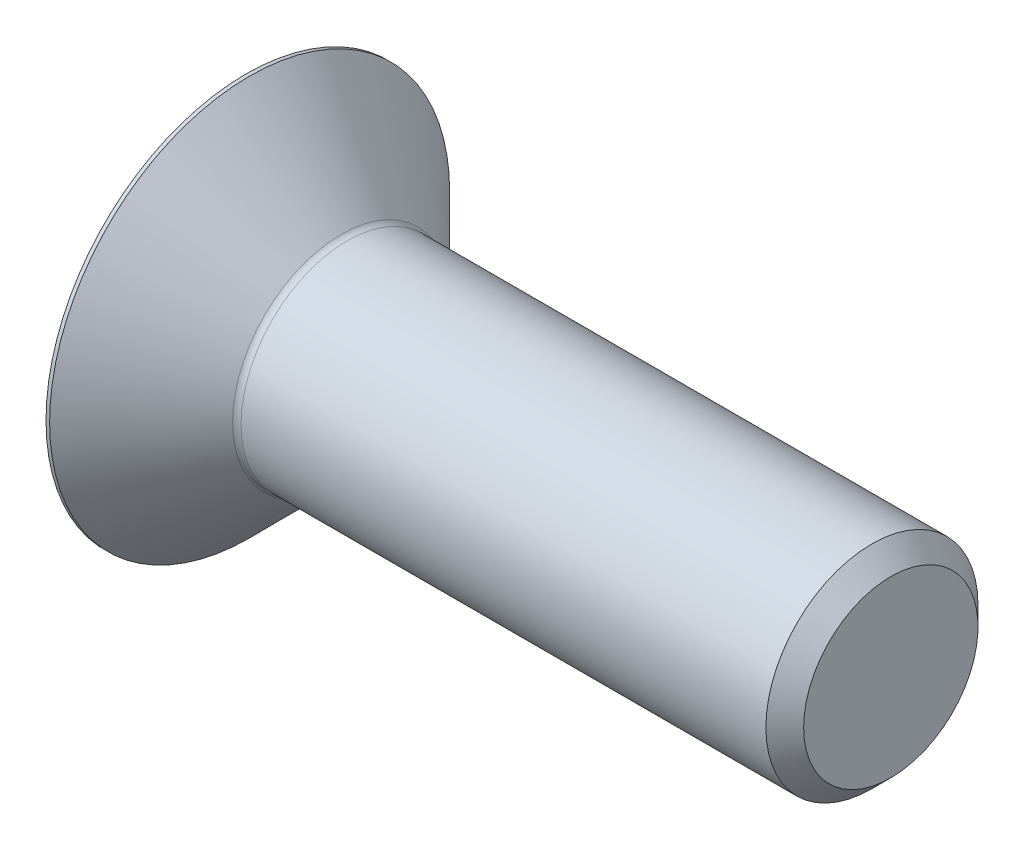
ISO-10303-21;
HEADER;
FILE_DESCRIPTION(('STEP AP214'),'2;1');
FILE_NAME('part.step','',(''),(''),'','','');
FILE_SCHEMA(('AUTOMOTIVE_DESIGN { 1 0 10303 214 1 1 1 1 }'));
ENDSEC;
DATA;
#1=APPLICATION_CONTEXT('core data for automotive mechanical design processes');
#2=APPLICATION_PROTOCOL_DEFINITION('international standard','automotive_design',2000,#1);
#3=PRODUCT_CONTEXT('',#1,'mechanical');
#4=PRODUCT('Part','Part','',(#3));
#5=PRODUCT_RELATED_PRODUCT_CATEGORY('part','',(#4));
#6=PRODUCT_DEFINITION_FORMATION('','',#4);
#7=PRODUCT_DEFINITION_CONTEXT('part definition',#1,'design');
#8=PRODUCT_DEFINITION('design','',#6,#7);
#9=PRODUCT_DEFINITION_SHAPE('','',#8);
#10=(LENGTH_UNIT() NAMED_UNIT(*) SI_UNIT(.MILLI.,.METRE.));
#11=(NAMED_UNIT(*) PLANE_ANGLE_UNIT() SI_UNIT($,.RADIAN.));
#12=(NAMED_UNIT(*) SI_UNIT($,.STERADIAN.) SOLID_ANGLE_UNIT());
#13=UNCERTAINTY_MEASURE_WITH_UNIT(LENGTH_MEASURE(1.E-05),#10,'distance_accuracy_value','');
#14=(GEOMETRIC_REPRESENTATION_CONTEXT(3) GLOBAL_UNCERTAINTY_ASSIGNED_CONTEXT((#13)) GLOBAL_UNIT_ASSIGNED_CONTEXT((#10,
#11,#12)) REPRESENTATION_CONTEXT('',''));
#15=CARTESIAN_POINT('',(0.,0.,0.));
#16=DIRECTION('',(0.,0.,1.));
#17=DIRECTION('',(1.,0.,0.));
#18=AXIS2_PLACEMENT_3D('',#15,#16,#17);
#19=CARTESIAN_POINT('',(0.,0.,0.));
#20=DIRECTION('',(-1.,0.,0.));
#21=DIRECTION('',(0.,0.,1.));
#22=AXIS2_PLACEMENT_3D('',#19,#20,#21);
#23=CYLINDRICAL_SURFACE('',#22,4.715);
#24=CARTESIAN_POINT('',(0.885000000000011,0.,0.));
#25=DIRECTION('',(-1.,0.,0.));
#26=DIRECTION('',(0.,0.,1.));
#27=AXIS2_PLACEMENT_3D('',#24,#25,#26);
#28=CIRCLE('',#27,4.715);
#29=CARTESIAN_POINT('',(0.885000000000011,0.,4.715));
#30=VERTEX_POINT('',#29);
#31=EDGE_CURVE('E155',#30,#30,#28,.T.);
#32=ORIENTED_EDGE('',*,*,#31,.T.);
#33=EDGE_LOOP('',(#32));
#34=FACE_BOUND('',#33,.T.);
#35=CARTESIAN_POINT('',(0.8,0.,0.));
#36=DIRECTION('',(-1.,0.,0.));
#37=DIRECTION('',(0.,0.,1.));
#38=AXIS2_PLACEMENT_3D('',#35,#36,#37);
#39=CIRCLE('',#38,4.715);
#40=CARTESIAN_POINT('',(0.8,0.,4.715));
#41=VERTEX_POINT('',#40);
#42=EDGE_CURVE('E181',#41,#41,#39,.T.);
#43=ORIENTED_EDGE('',*,*,#42,.F.);
#44=EDGE_LOOP('',(#43));
#45=FACE_BOUND('',#44,.T.);
#46=ADVANCED_FACE('F32',(#34,#45),#23,.T.);
#47=CARTESIAN_POINT('',(0.885000000000011,0.,0.));
#48=DIRECTION('',(-1.,0.,0.));
#49=DIRECTION('',(0.,0.,1.));
#50=AXIS2_PLACEMENT_3D('',#47,#48,#49);
#51=CONICAL_SURFACE('',#50,4.715,0.785398163397451);
#52=CARTESIAN_POINT('',(3.04142135623731,0.,0.));
#53=DIRECTION('',(-1.,0.,0.));
#54=DIRECTION('',(0.,0.,1.));
#55=AXIS2_PLACEMENT_3D('',#52,#53,#54);
#56=CIRCLE('',#55,2.55857864376269);
#57=CARTESIAN_POINT('',(3.04142135623731,0.,2.55857864376269));
#58=VERTEX_POINT('',#57);
#59=EDGE_CURVE('E158',#58,#58,#56,.T.);
#60=ORIENTED_EDGE('',*,*,#59,.T.);
#61=EDGE_LOOP('',(#60));
#62=FACE_BOUND('',#61,.T.);
#63=ORIENTED_EDGE('',*,*,#31,.F.);
#64=EDGE_LOOP('',(#63));
#65=FACE_BOUND('',#64,.T.);
#66=ADVANCED_FACE('F171',(#62,#65),#51,.T.);
#67=CARTESIAN_POINT('',(0.,0.,0.));
#68=DIRECTION('',(-1.,0.,0.));
#69=DIRECTION('',(0.,0.,1.));
#70=AXIS2_PLACEMENT_3D('',#67,#68,#69);
#71=CYLINDRICAL_SURFACE('',#70,2.5);
#72=CARTESIAN_POINT('',(3.18284271247462,0.,0.));
#73=DIRECTION('',(-1.,0.,0.));
#74=DIRECTION('',(0.,0.,1.));
#75=AXIS2_PLACEMENT_3D('',#72,#73,#74);
#76=CIRCLE('',#75,2.5);
#77=CARTESIAN_POINT('',(3.18284271247462,0.,2.5));
#78=VERTEX_POINT('',#77);
#79=EDGE_CURVE('E40',#78,#78,#76,.F.);
#80=ORIENTED_EDGE('',*,*,#79,.T.);
#81=EDGE_LOOP('',(#80));
#82=FACE_BOUND('',#81,.T.);
#83=CARTESIAN_POINT('',(15.555,0.,0.));
#84=DIRECTION('',(-1.,0.,0.));
#85=DIRECTION('',(0.,0.,1.));
#86=AXIS2_PLACEMENT_3D('',#83,#84,#85);
#87=CIRCLE('',#86,2.5);
#88=CARTESIAN_POINT('',(15.555,0.,2.5));
#89=VERTEX_POINT('',#88);
#90=EDGE_CURVE('E152',#89,#89,#87,.T.);
#91=ORIENTED_EDGE('',*,*,#90,.T.);
#92=EDGE_LOOP('',(#91));
#93=FACE_BOUND('',#92,.T.);
#94=ADVANCED_FACE('F163',(#82,#93),#71,.T.);
#95=CARTESIAN_POINT('',(16.,0.,0.));
#96=DIRECTION('',(-1.,0.,0.));
#97=DIRECTION('',(0.,0.,1.));
#98=AXIS2_PLACEMENT_3D('',#95,#96,#97);
#99=CONICAL_SURFACE('',#98,2.055,0.785398163397446);
#100=ORIENTED_EDGE('',*,*,#90,.F.);
#101=EDGE_LOOP('',(#100));
#102=FACE_BOUND('',#101,.T.);
#103=CARTESIAN_POINT('',(16.,0.,0.));
#104=DIRECTION('',(-1.,0.,0.));
#105=DIRECTION('',(0.,0.,1.));
#106=AXIS2_PLACEMENT_3D('',#103,#104,#105);
#107=CIRCLE('',#106,2.055);
#108=CARTESIAN_POINT('',(16.,0.,2.055));
#109=VERTEX_POINT('',#108);
#110=EDGE_CURVE('E148',#109,#109,#107,.T.);
#111=ORIENTED_EDGE('',*,*,#110,.T.);
#112=EDGE_LOOP('',(#111));
#113=FACE_BOUND('',#112,.T.);
#114=ADVANCED_FACE('F262',(#102,#113),#99,.T.);
#115=CARTESIAN_POINT('',(16.,2.055,0.));
#116=DIRECTION('',(1.,0.,0.));
#117=DIRECTION('',(0.,0.,-1.));
#118=AXIS2_PLACEMENT_3D('',#115,#116,#117);
#119=PLANE('',#118);
#120=ORIENTED_EDGE('',*,*,#110,.F.);
#121=EDGE_LOOP('',(#120));
#122=FACE_BOUND('',#121,.T.);
#123=ADVANCED_FACE('F168',(#122),#119,.T.);
#124=CARTESIAN_POINT('',(3.18284271247462,0.,0.));
#125=DIRECTION('',(-1.,0.,0.));
#126=DIRECTION('',(0.,0.,1.));
#127=AXIS2_PLACEMENT_3D('',#124,#125,#126);
#128=TOROIDAL_SURFACE('',#127,2.7,0.2);
#129=ORIENTED_EDGE('',*,*,#79,.F.);
#130=EDGE_LOOP('',(#129));
#131=FACE_BOUND('',#130,.T.);
#132=ORIENTED_EDGE('',*,*,#59,.F.);
#133=EDGE_LOOP('',(#132));
#134=FACE_BOUND('',#133,.T.);
#135=ADVANCED_FACE('F34',(#131,#134),#128,.F.);
#136=CARTESIAN_POINT('',(0.8,0.,0.));
#137=DIRECTION('',(-1.,0.,0.));
#138=DIRECTION('',(0.,0.,1.));
#139=AXIS2_PLACEMENT_3D('',#136,#137,#138);
#140=PLANE('',#139);
#141=DIRECTION('',(0.,-1.,0.));
#142=VECTOR('',#141,1.);
#143=CARTESIAN_POINT('',(0.8,-0.866025403784438,-1.5));
#144=LINE('',#143,#142);
#145=CARTESIAN_POINT('',(0.8,0.866025403784438,-1.5));
#146=VERTEX_POINT('',#145);
#147=CARTESIAN_POINT('',(0.8,-0.866025403784438,-1.5));
#148=VERTEX_POINT('',#147);
#149=EDGE_CURVE('E121',#146,#148,#144,.T.);
#150=ORIENTED_EDGE('',*,*,#149,.F.);
#151=DIRECTION('',(0.,-0.500000000000001,-0.866025403784438));
#152=VECTOR('',#151,1.);
#153=CARTESIAN_POINT('',(0.8,0.866025403784438,-1.5));
#154=LINE('',#153,#152);
#155=CARTESIAN_POINT('',(0.8,1.73205080756888,0.));
#156=VERTEX_POINT('',#155);
#157=EDGE_CURVE('E188',#156,#146,#154,.T.);
#158=ORIENTED_EDGE('',*,*,#157,.F.);
#159=DIRECTION('',(0.,0.5,-0.866025403784439));
#160=VECTOR('',#159,1.);
#161=CARTESIAN_POINT('',(0.8,1.73205080756888,0.));
#162=LINE('',#161,#160);
#163=CARTESIAN_POINT('',(0.8,0.866025403784438,1.5));
#164=VERTEX_POINT('',#163);
#165=EDGE_CURVE('E183',#164,#156,#162,.T.);
#166=ORIENTED_EDGE('',*,*,#165,.F.);
#167=DIRECTION('',(0.,1.,0.));
#168=VECTOR('',#167,1.);
#169=CARTESIAN_POINT('',(0.8,0.866025403784438,1.5));
#170=LINE('',#169,#168);
#171=CARTESIAN_POINT('',(0.800000000000001,-0.866025403784438,1.5));
#172=VERTEX_POINT('',#171);
#173=EDGE_CURVE('E47',#172,#164,#170,.T.);
#174=ORIENTED_EDGE('',*,*,#173,.F.);
#175=DIRECTION('',(0.,0.499999999999999,0.866025403784439));
#176=VECTOR('',#175,1.);
#177=CARTESIAN_POINT('',(0.8,-0.866025403784438,1.5));
#178=LINE('',#177,#176);
#179=CARTESIAN_POINT('',(0.8,-1.73205080756887,0.));
#180=VERTEX_POINT('',#179);
#181=EDGE_CURVE('E11',#180,#172,#178,.T.);
#182=ORIENTED_EDGE('',*,*,#181,.F.);
#183=DIRECTION('',(0.,-0.499999999999999,0.866025403784439));
#184=VECTOR('',#183,1.);
#185=CARTESIAN_POINT('',(0.8,-1.73205080756887,0.));
#186=LINE('',#185,#184);
#187=EDGE_CURVE('E106',#148,#180,#186,.T.);
#188=ORIENTED_EDGE('',*,*,#187,.F.);
#189=EDGE_LOOP('',(#150,#158,#166,#174,#182,#188));
#190=FACE_BOUND('',#189,.T.);
#191=ORIENTED_EDGE('',*,*,#42,.T.);
#192=EDGE_LOOP('',(#191));
#193=FACE_BOUND('',#192,.T.);
#194=ADVANCED_FACE('F104',(#190,#193),#140,.T.);
#195=CARTESIAN_POINT('',(1.9,0.,0.));
#196=DIRECTION('',(-1.,0.,0.));
#197=DIRECTION('',(0.,0.,1.));
#198=AXIS2_PLACEMENT_3D('',#195,#196,#197);
#199=CONICAL_SURFACE('',#198,1.5,1.04719755119659);
#200=CARTESIAN_POINT('',(2.76602540378445,0.,0.));
#201=VERTEX_POINT('',#200);
#202=VERTEX_LOOP('',#201);
#203=FACE_BOUND('',#202,.T.);
#204=CARTESIAN_POINT('',(1.9,0.,0.));
#205=DIRECTION('',(-1.,0.,0.));
#206=DIRECTION('',(0.,0.,1.));
#207=AXIS2_PLACEMENT_3D('',#204,#205,#206);
#208=CIRCLE('',#207,1.5);
#209=CARTESIAN_POINT('',(1.9,0.,1.5));
#210=VERTEX_POINT('',#209);
#211=CARTESIAN_POINT('',(1.9,1.29903810567666,0.750000000000001));
#212=VERTEX_POINT('',#211);
#213=EDGE_CURVE('E145',#210,#212,#208,.T.);
#214=ORIENTED_EDGE('',*,*,#213,.T.);
#215=CARTESIAN_POINT('',(1.9,1.29903810567666,-0.750000000000003));
#216=VERTEX_POINT('',#215);
#217=EDGE_CURVE('E149',#212,#216,#208,.T.);
#218=ORIENTED_EDGE('',*,*,#217,.T.);
#219=CARTESIAN_POINT('',(1.9,0.,-1.5));
#220=VERTEX_POINT('',#219);
#221=EDGE_CURVE('E227',#216,#220,#208,.T.);
#222=ORIENTED_EDGE('',*,*,#221,.T.);
#223=CARTESIAN_POINT('',(1.9,-1.29903810567666,-0.749999999999998));
#224=VERTEX_POINT('',#223);
#225=EDGE_CURVE('E224',#220,#224,#208,.T.);
#226=ORIENTED_EDGE('',*,*,#225,.T.);
#227=CARTESIAN_POINT('',(1.9,-1.29903810567666,0.749999999999997));
#228=VERTEX_POINT('',#227);
#229=EDGE_CURVE('E217',#224,#228,#208,.T.);
#230=ORIENTED_EDGE('',*,*,#229,.T.);
#231=EDGE_CURVE('E144',#228,#210,#208,.T.);
#232=ORIENTED_EDGE('',*,*,#231,.T.);
#233=EDGE_LOOP('',(#214,#218,#222,#226,#230,#232));
#234=FACE_BOUND('',#233,.T.);
#235=ADVANCED_FACE('F225',(#203,#234),#199,.F.);
#236=CARTESIAN_POINT('',(1.9,-0.866025403784437,-1.5));
#237=DIRECTION('',(1.,0.,0.));
#238=DIRECTION('',(0.,0.,-1.));
#239=AXIS2_PLACEMENT_3D('',#236,#237,#238);
#240=PLANE('',#239);
#241=DIRECTION('',(0.,1.,0.));
#242=VECTOR('',#241,1.);
#243=CARTESIAN_POINT('',(1.9,-0.866025403784438,-1.5));
#244=LINE('',#243,#242);
#245=CARTESIAN_POINT('',(1.9,-0.866025403784438,-1.5));
#246=VERTEX_POINT('',#245);
#247=EDGE_CURVE('E54',#246,#220,#244,.T.);
#248=ORIENTED_EDGE('',*,*,#247,.F.);
#249=DIRECTION('',(0.,0.499999999999999,-0.866025403784439));
#250=VECTOR('',#249,1.);
#251=CARTESIAN_POINT('',(1.9,-1.73205080756887,0.));
#252=LINE('',#251,#250);
#253=EDGE_CURVE('E120',#224,#246,#252,.T.);
#254=ORIENTED_EDGE('',*,*,#253,.F.);
#255=ORIENTED_EDGE('',*,*,#225,.F.);
#256=EDGE_LOOP('',(#248,#254,#255));
#257=FACE_BOUND('',#256,.T.);
#258=ADVANCED_FACE('F258',(#257),#240,.F.);
#259=DIRECTION('',(0.,0.500000000000001,0.866025403784438));
#260=VECTOR('',#259,1.);
#261=CARTESIAN_POINT('',(1.9,0.866025403784438,-1.5));
#262=LINE('',#261,#260);
#263=CARTESIAN_POINT('',(1.9,0.866025403784438,-1.5));
#264=VERTEX_POINT('',#263);
#265=EDGE_CURVE('E197',#264,#216,#262,.T.);
#266=ORIENTED_EDGE('',*,*,#265,.F.);
#267=EDGE_CURVE('E194',#220,#264,#244,.T.);
#268=ORIENTED_EDGE('',*,*,#267,.F.);
#269=ORIENTED_EDGE('',*,*,#221,.F.);
#270=EDGE_LOOP('',(#266,#268,#269));
#271=FACE_BOUND('',#270,.T.);
#272=ADVANCED_FACE('F244',(#271),#240,.F.);
#273=DIRECTION('',(0.,-0.5,0.866025403784438));
#274=VECTOR('',#273,1.);
#275=CARTESIAN_POINT('',(1.9,1.73205080756888,0.));
#276=LINE('',#275,#274);
#277=CARTESIAN_POINT('',(1.9,1.73205080756888,0.));
#278=VERTEX_POINT('',#277);
#279=EDGE_CURVE('E201',#278,#212,#276,.T.);
#280=ORIENTED_EDGE('',*,*,#279,.F.);
#281=EDGE_CURVE('E196',#216,#278,#262,.T.);
#282=ORIENTED_EDGE('',*,*,#281,.F.);
#283=ORIENTED_EDGE('',*,*,#217,.F.);
#284=EDGE_LOOP('',(#280,#282,#283));
#285=FACE_BOUND('',#284,.T.);
#286=ADVANCED_FACE('F233',(#285),#240,.F.);
#287=DIRECTION('',(0.,-1.,0.));
#288=VECTOR('',#287,1.);
#289=CARTESIAN_POINT('',(1.9,0.866025403784438,1.5));
#290=LINE('',#289,#288);
#291=CARTESIAN_POINT('',(1.9,0.866025403784438,1.5));
#292=VERTEX_POINT('',#291);
#293=EDGE_CURVE('E204',#292,#210,#290,.T.);
#294=ORIENTED_EDGE('',*,*,#293,.F.);
#295=EDGE_CURVE('E200',#212,#292,#276,.T.);
#296=ORIENTED_EDGE('',*,*,#295,.F.);
#297=ORIENTED_EDGE('',*,*,#213,.F.);
#298=EDGE_LOOP('',(#294,#296,#297));
#299=FACE_BOUND('',#298,.T.);
#300=ADVANCED_FACE('F235',(#299),#240,.F.);
#301=CARTESIAN_POINT('',(1.9,-1.73205080756887,0.));
#302=VERTEX_POINT('',#301);
#303=EDGE_CURVE('E192',#302,#224,#252,.T.);
#304=ORIENTED_EDGE('',*,*,#303,.F.);
#305=DIRECTION('',(0.,-0.499999999999999,-0.866025403784439));
#306=VECTOR('',#305,1.);
#307=CARTESIAN_POINT('',(1.9,-0.866025403784438,1.5));
#308=LINE('',#307,#306);
#309=EDGE_CURVE('E126',#228,#302,#308,.T.);
#310=ORIENTED_EDGE('',*,*,#309,.F.);
#311=ORIENTED_EDGE('',*,*,#229,.F.);
#312=EDGE_LOOP('',(#304,#310,#311));
#313=FACE_BOUND('',#312,.T.);
#314=ADVANCED_FACE('F219',(#313),#240,.F.);
#315=CARTESIAN_POINT('',(1.9,-0.866025403784438,1.5));
#316=VERTEX_POINT('',#315);
#317=EDGE_CURVE('E128',#316,#228,#308,.T.);
#318=ORIENTED_EDGE('',*,*,#317,.F.);
#319=EDGE_CURVE('E203',#210,#316,#290,.T.);
#320=ORIENTED_EDGE('',*,*,#319,.F.);
#321=ORIENTED_EDGE('',*,*,#231,.F.);
#322=EDGE_LOOP('',(#318,#320,#321));
#323=FACE_BOUND('',#322,.T.);
#324=ADVANCED_FACE('F215',(#323),#240,.F.);
#325=CARTESIAN_POINT('',(1.9,-0.866025403784438,1.5));
#326=DIRECTION('',(0.,0.866025403784439,-0.499999999999999));
#327=DIRECTION('',(0.,0.499999999999999,0.866025403784439));
#328=AXIS2_PLACEMENT_3D('',#325,#326,#327);
#329=PLANE('',#328);
#330=DIRECTION('',(-1.,0.,0.));
#331=VECTOR('',#330,1.);
#332=CARTESIAN_POINT('',(1.9,-1.73205080756887,0.));
#333=LINE('',#332,#331);
#334=EDGE_CURVE('E117',#302,#180,#333,.T.);
#335=ORIENTED_EDGE('',*,*,#334,.T.);
#336=ORIENTED_EDGE('',*,*,#181,.T.);
#337=DIRECTION('',(-1.,0.,0.));
#338=VECTOR('',#337,1.);
#339=CARTESIAN_POINT('',(1.9,-0.866025403784438,1.5));
#340=LINE('',#339,#338);
#341=EDGE_CURVE('E127',#316,#172,#340,.T.);
#342=ORIENTED_EDGE('',*,*,#341,.F.);
#343=ORIENTED_EDGE('',*,*,#317,.T.);
#344=ORIENTED_EDGE('',*,*,#309,.T.);
#345=EDGE_LOOP('',(#335,#336,#342,#343,#344));
#346=FACE_BOUND('',#345,.T.);
#347=ADVANCED_FACE('F123',(#346),#329,.T.);
#348=CARTESIAN_POINT('',(1.9,0.866025403784438,1.5));
#349=DIRECTION('',(0.,0.,-1.));
#350=DIRECTION('',(0.,1.,0.));
#351=AXIS2_PLACEMENT_3D('',#348,#349,#350);
#352=PLANE('',#351);
#353=ORIENTED_EDGE('',*,*,#341,.T.);
#354=ORIENTED_EDGE('',*,*,#173,.T.);
#355=DIRECTION('',(-1.,0.,0.));
#356=VECTOR('',#355,1.);
#357=CARTESIAN_POINT('',(1.9,0.866025403784438,1.5));
#358=LINE('',#357,#356);
#359=EDGE_CURVE('E130',#292,#164,#358,.T.);
#360=ORIENTED_EDGE('',*,*,#359,.F.);
#361=ORIENTED_EDGE('',*,*,#293,.T.);
#362=ORIENTED_EDGE('',*,*,#319,.T.);
#363=EDGE_LOOP('',(#353,#354,#360,#361,#362));
#364=FACE_BOUND('',#363,.T.);
#365=ADVANCED_FACE('F211',(#364),#352,.T.);
#366=CARTESIAN_POINT('',(1.9,1.73205080756888,0.));
#367=DIRECTION('',(0.,-0.866025403784439,-0.5));
#368=DIRECTION('',(0.,0.5,-0.866025403784439));
#369=AXIS2_PLACEMENT_3D('',#366,#367,#368);
#370=PLANE('',#369);
#371=ORIENTED_EDGE('',*,*,#359,.T.);
#372=ORIENTED_EDGE('',*,*,#165,.T.);
#373=DIRECTION('',(-1.,0.,0.));
#374=VECTOR('',#373,1.);
#375=CARTESIAN_POINT('',(1.9,1.73205080756888,0.));
#376=LINE('',#375,#374);
#377=EDGE_CURVE('E137',#278,#156,#376,.T.);
#378=ORIENTED_EDGE('',*,*,#377,.F.);
#379=ORIENTED_EDGE('',*,*,#279,.T.);
#380=ORIENTED_EDGE('',*,*,#295,.T.);
#381=EDGE_LOOP('',(#371,#372,#378,#379,#380));
#382=FACE_BOUND('',#381,.T.);
#383=ADVANCED_FACE('F238',(#382),#370,.T.);
#384=CARTESIAN_POINT('',(1.9,0.866025403784438,-1.5));
#385=DIRECTION('',(0.,-0.866025403784438,0.500000000000001));
#386=DIRECTION('',(0.,-0.500000000000001,-0.866025403784438));
#387=AXIS2_PLACEMENT_3D('',#384,#385,#386);
#388=PLANE('',#387);
#389=ORIENTED_EDGE('',*,*,#377,.T.);
#390=ORIENTED_EDGE('',*,*,#157,.T.);
#391=DIRECTION('',(-1.,0.,0.));
#392=VECTOR('',#391,1.);
#393=CARTESIAN_POINT('',(1.9,0.866025403784438,-1.5));
#394=LINE('',#393,#392);
#395=EDGE_CURVE('E140',#264,#146,#394,.T.);
#396=ORIENTED_EDGE('',*,*,#395,.F.);
#397=ORIENTED_EDGE('',*,*,#265,.T.);
#398=ORIENTED_EDGE('',*,*,#281,.T.);
#399=EDGE_LOOP('',(#389,#390,#396,#397,#398));
#400=FACE_BOUND('',#399,.T.);
#401=ADVANCED_FACE('F240',(#400),#388,.T.);
#402=CARTESIAN_POINT('',(1.9,-0.866025403784438,-1.5));
#403=DIRECTION('',(0.,0.,1.));
#404=DIRECTION('',(0.,-1.,0.));
#405=AXIS2_PLACEMENT_3D('',#402,#403,#404);
#406=PLANE('',#405);
#407=ORIENTED_EDGE('',*,*,#395,.T.);
#408=ORIENTED_EDGE('',*,*,#149,.T.);
#409=DIRECTION('',(-1.,0.,0.));
#410=VECTOR('',#409,1.);
#411=CARTESIAN_POINT('',(1.9,-0.866025403784438,-1.5));
#412=LINE('',#411,#410);
#413=EDGE_CURVE('E119',#246,#148,#412,.T.);
#414=ORIENTED_EDGE('',*,*,#413,.F.);
#415=ORIENTED_EDGE('',*,*,#247,.T.);
#416=ORIENTED_EDGE('',*,*,#267,.T.);
#417=EDGE_LOOP('',(#407,#408,#414,#415,#416));
#418=FACE_BOUND('',#417,.T.);
#419=ADVANCED_FACE('F245',(#418),#406,.T.);
#420=CARTESIAN_POINT('',(1.9,-1.73205080756887,0.));
#421=DIRECTION('',(0.,0.866025403784439,0.499999999999999));
#422=DIRECTION('',(0.,-0.499999999999999,0.866025403784439));
#423=AXIS2_PLACEMENT_3D('',#420,#421,#422);
#424=PLANE('',#423);
#425=ORIENTED_EDGE('',*,*,#413,.T.);
#426=ORIENTED_EDGE('',*,*,#187,.T.);
#427=ORIENTED_EDGE('',*,*,#334,.F.);
#428=ORIENTED_EDGE('',*,*,#303,.T.);
#429=ORIENTED_EDGE('',*,*,#253,.T.);
#430=EDGE_LOOP('',(#425,#426,#427,#428,#429));
#431=FACE_BOUND('',#430,.T.);
#432=ADVANCED_FACE('F115',(#431),#424,.T.);
#433=CLOSED_SHELL('',(#46,#66,#94,#114,#123,#135,#194,#235,#258,#272,#286,#300,#314,#324,#347,
#365,#383,#401,#419,#432));
#434=MANIFOLD_SOLID_BREP('B2',#433);
#435=ADVANCED_BREP_SHAPE_REPRESENTATION('',(#18,#434),#14);
#436=SHAPE_DEFINITION_REPRESENTATION(#9,#435);
ENDSEC;
END-ISO-10303-21;
